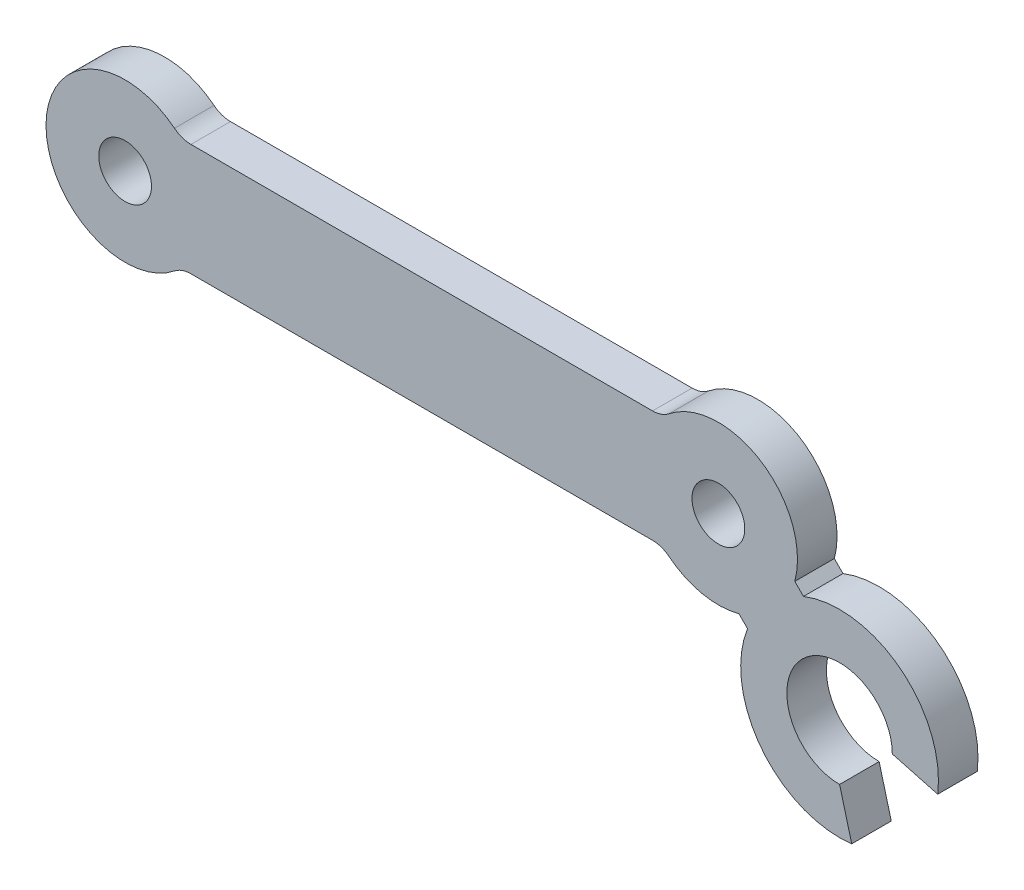
ISO-10303-21;
HEADER;
FILE_DESCRIPTION(('STEP AP214'),'2;1');
FILE_NAME('part.step','',(''),(''),'','','');
FILE_SCHEMA(('AUTOMOTIVE_DESIGN { 1 0 10303 214 1 1 1 1 }'));
ENDSEC;
DATA;
#1=APPLICATION_CONTEXT('core data for automotive mechanical design processes');
#2=APPLICATION_PROTOCOL_DEFINITION('international standard','automotive_design',2000,#1);
#3=PRODUCT_CONTEXT('',#1,'mechanical');
#4=PRODUCT('Part','Part','',(#3));
#5=PRODUCT_RELATED_PRODUCT_CATEGORY('part','',(#4));
#6=PRODUCT_DEFINITION_FORMATION('','',#4);
#7=PRODUCT_DEFINITION_CONTEXT('part definition',#1,'design');
#8=PRODUCT_DEFINITION('design','',#6,#7);
#9=PRODUCT_DEFINITION_SHAPE('','',#8);
#10=(LENGTH_UNIT() NAMED_UNIT(*) SI_UNIT(.MILLI.,.METRE.));
#11=(NAMED_UNIT(*) PLANE_ANGLE_UNIT() SI_UNIT($,.RADIAN.));
#12=(NAMED_UNIT(*) SI_UNIT($,.STERADIAN.) SOLID_ANGLE_UNIT());
#13=UNCERTAINTY_MEASURE_WITH_UNIT(LENGTH_MEASURE(1.E-05),#10,'distance_accuracy_value','');
#14=(GEOMETRIC_REPRESENTATION_CONTEXT(3) GLOBAL_UNCERTAINTY_ASSIGNED_CONTEXT((#13)) GLOBAL_UNIT_ASSIGNED_CONTEXT((#10,
#11,#12)) REPRESENTATION_CONTEXT('',''));
#15=CARTESIAN_POINT('',(0.,0.,0.));
#16=DIRECTION('',(0.,0.,1.));
#17=DIRECTION('',(1.,0.,0.));
#18=AXIS2_PLACEMENT_3D('',#15,#16,#17);
#19=CARTESIAN_POINT('',(4.99374608885954,6.25,3.));
#20=DIRECTION('',(0.,0.,-1.));
#21=DIRECTION('',(-1.,0.,0.));
#22=AXIS2_PLACEMENT_3D('',#19,#20,#21);
#23=PLANE('',#22);
#24=CARTESIAN_POINT('',(4.99374608885954,6.25,3.));
#25=DIRECTION('',(0.,0.,-1.));
#26=DIRECTION('',(-1.,0.,0.));
#27=AXIS2_PLACEMENT_3D('',#24,#25,#26);
#28=CIRCLE('',#27,2.);
#29=CARTESIAN_POINT('',(4.99374608885954,4.25,3.));
#30=VERTEX_POINT('',#29);
#31=CARTESIAN_POINT('',(3.74530956664466,4.6875,3.));
#32=VERTEX_POINT('',#31);
#33=EDGE_CURVE('E217',#30,#32,#28,.T.);
#34=ORIENTED_EDGE('',*,*,#33,.T.);
#35=CARTESIAN_POINT('',(0.,0.,3.));
#36=DIRECTION('',(0.,0.,1.));
#37=DIRECTION('',(1.,0.,0.));
#38=AXIS2_PLACEMENT_3D('',#35,#36,#37);
#39=CIRCLE('',#38,6.);
#40=CARTESIAN_POINT('',(3.74530956664466,-4.6875,3.));
#41=VERTEX_POINT('',#40);
#42=EDGE_CURVE('E123',#32,#41,#39,.T.);
#43=ORIENTED_EDGE('',*,*,#42,.T.);
#44=CARTESIAN_POINT('',(4.99374608885954,-6.25,3.));
#45=DIRECTION('',(0.,0.,-1.));
#46=DIRECTION('',(1.,0.,0.));
#47=AXIS2_PLACEMENT_3D('',#44,#45,#46);
#48=CIRCLE('',#47,2.);
#49=CARTESIAN_POINT('',(4.99374608885954,-4.25,3.));
#50=VERTEX_POINT('',#49);
#51=EDGE_CURVE('E256',#41,#50,#48,.T.);
#52=ORIENTED_EDGE('',*,*,#51,.T.);
#53=DIRECTION('',(1.,0.,0.));
#54=VECTOR('',#53,1.);
#55=CARTESIAN_POINT('',(4.99374608885954,-4.25,3.));
#56=LINE('',#55,#54);
#57=CARTESIAN_POINT('',(40.0062539111404,-4.25,3.));
#58=VERTEX_POINT('',#57);
#59=EDGE_CURVE('E275',#50,#58,#56,.T.);
#60=ORIENTED_EDGE('',*,*,#59,.T.);
#61=CARTESIAN_POINT('',(40.0062539111404,-6.25,3.));
#62=DIRECTION('',(0.,0.,-1.));
#63=DIRECTION('',(-1.,0.,0.));
#64=AXIS2_PLACEMENT_3D('',#61,#62,#63);
#65=CIRCLE('',#64,2.);
#66=CARTESIAN_POINT('',(41.2546904333553,-4.6875,3.));
#67=VERTEX_POINT('',#66);
#68=EDGE_CURVE('E272',#58,#67,#65,.T.);
#69=ORIENTED_EDGE('',*,*,#68,.T.);
#70=CARTESIAN_POINT('',(45.,0.,3.));
#71=DIRECTION('',(0.,0.,1.));
#72=DIRECTION('',(-1.,0.,0.));
#73=AXIS2_PLACEMENT_3D('',#70,#71,#72);
#74=CIRCLE('',#73,6.00000000000001);
#75=CARTESIAN_POINT('',(46.5529142706151,-5.79555495773442,3.));
#76=VERTEX_POINT('',#75);
#77=EDGE_CURVE('E274',#67,#76,#74,.T.);
#78=ORIENTED_EDGE('',*,*,#77,.T.);
#79=DIRECTION('',(0.707106781186616,-0.707106781186479,0.));
#80=VECTOR('',#79,1.);
#81=CARTESIAN_POINT('',(46.7677669529664,-6.01040764008564,3.));
#82=LINE('',#81,#80);
#83=CARTESIAN_POINT('',(47.2105122880596,-6.45315297517885,3.));
#84=VERTEX_POINT('',#83);
#85=EDGE_CURVE('E277',#76,#84,#82,.T.);
#86=ORIENTED_EDGE('',*,*,#85,.T.);
#87=CARTESIAN_POINT('',(54.1923881554251,-9.19238815542513,3.));
#88=DIRECTION('',(0.,0.,1.));
#89=DIRECTION('',(1.,0.,0.));
#90=AXIS2_PLACEMENT_3D('',#87,#88,#89);
#91=CIRCLE('',#90,7.5);
#92=CARTESIAN_POINT('',(55.1149486223124,-16.6354306909033,3.));
#93=VERTEX_POINT('',#92);
#94=EDGE_CURVE('E283',#84,#93,#91,.T.);
#95=ORIENTED_EDGE('',*,*,#94,.T.);
#96=DIRECTION('',(-0.258819045102518,0.965925826289069,0.));
#97=VECTOR('',#96,1.);
#98=CARTESIAN_POINT('',(54.1923881554251,-13.1923881554251,3.));
#99=LINE('',#98,#97);
#100=CARTESIAN_POINT('',(54.1923881554251,-13.1923881554251,3.));
#101=VERTEX_POINT('',#100);
#102=EDGE_CURVE('E285',#93,#101,#99,.T.);
#103=ORIENTED_EDGE('',*,*,#102,.T.);
#104=CARTESIAN_POINT('',(54.1923881554251,-9.19238815542513,3.));
#105=DIRECTION('',(0.,0.,-1.));
#106=DIRECTION('',(1.,0.,0.));
#107=AXIS2_PLACEMENT_3D('',#104,#105,#106);
#108=CIRCLE('',#107,4.);
#109=CARTESIAN_POINT('',(58.1923881554251,-9.19238815542513,3.));
#110=VERTEX_POINT('',#109);
#111=EDGE_CURVE('E287',#101,#110,#108,.T.);
#112=ORIENTED_EDGE('',*,*,#111,.T.);
#113=DIRECTION('',(0.965925826289068,-0.258819045102522,0.));
#114=VECTOR('',#113,1.);
#115=CARTESIAN_POINT('',(58.1923881554251,-9.19238815542513,3.));
#116=LINE('',#115,#114);
#117=CARTESIAN_POINT('',(61.6354306909032,-10.1149486223125,3.));
#118=VERTEX_POINT('',#117);
#119=EDGE_CURVE('E289',#110,#118,#116,.T.);
#120=ORIENTED_EDGE('',*,*,#119,.T.);
#121=CARTESIAN_POINT('',(54.1923881554251,-9.19238815542513,3.));
#122=DIRECTION('',(0.,0.,1.));
#123=DIRECTION('',(1.,0.,0.));
#124=AXIS2_PLACEMENT_3D('',#121,#122,#123);
#125=CIRCLE('',#124,7.5);
#126=CARTESIAN_POINT('',(51.453152975179,-2.21051228805952,3.));
#127=VERTEX_POINT('',#126);
#128=EDGE_CURVE('E291',#118,#127,#125,.T.);
#129=ORIENTED_EDGE('',*,*,#128,.T.);
#130=DIRECTION('',(-0.707106781186547,0.707106781186548,0.));
#131=VECTOR('',#130,1.);
#132=CARTESIAN_POINT('',(51.0104076400858,-1.76776695296626,3.));
#133=LINE('',#132,#131);
#134=CARTESIAN_POINT('',(50.7955549577345,-1.55291427061498,3.));
#135=VERTEX_POINT('',#134);
#136=EDGE_CURVE('E166',#127,#135,#133,.T.);
#137=ORIENTED_EDGE('',*,*,#136,.T.);
#138=CARTESIAN_POINT('',(45.,0.,3.));
#139=DIRECTION('',(0.,0.,1.));
#140=DIRECTION('',(-1.,0.,0.));
#141=AXIS2_PLACEMENT_3D('',#138,#139,#140);
#142=CIRCLE('',#141,6.00000000000001);
#143=CARTESIAN_POINT('',(41.2546904333553,4.6875,3.));
#144=VERTEX_POINT('',#143);
#145=EDGE_CURVE('E160',#135,#144,#142,.T.);
#146=ORIENTED_EDGE('',*,*,#145,.T.);
#147=CARTESIAN_POINT('',(40.0062539111404,6.25,3.));
#148=DIRECTION('',(0.,0.,-1.));
#149=DIRECTION('',(1.,0.,0.));
#150=AXIS2_PLACEMENT_3D('',#147,#148,#149);
#151=CIRCLE('',#150,2.);
#152=CARTESIAN_POINT('',(40.0062539111404,4.25,3.));
#153=VERTEX_POINT('',#152);
#154=EDGE_CURVE('E164',#144,#153,#151,.T.);
#155=ORIENTED_EDGE('',*,*,#154,.T.);
#156=DIRECTION('',(-1.,0.,0.));
#157=VECTOR('',#156,1.);
#158=CARTESIAN_POINT('',(4.99374608885954,4.25,3.));
#159=LINE('',#158,#157);
#160=EDGE_CURVE('E56',#153,#30,#159,.T.);
#161=ORIENTED_EDGE('',*,*,#160,.T.);
#162=EDGE_LOOP('',(#34,#43,#52,#60,#69,#78,#86,#95,#103,#112,#120,#129,#137,#146,#155,#161));
#163=FACE_BOUND('',#162,.T.);
#164=CARTESIAN_POINT('',(0.,0.,3.));
#165=DIRECTION('',(0.,0.,1.));
#166=DIRECTION('',(1.,0.,0.));
#167=AXIS2_PLACEMENT_3D('',#164,#165,#166);
#168=CIRCLE('',#167,2.);
#169=CARTESIAN_POINT('',(2.,0.,3.));
#170=VERTEX_POINT('',#169);
#171=EDGE_CURVE('E188',#170,#170,#168,.T.);
#172=ORIENTED_EDGE('',*,*,#171,.F.);
#173=EDGE_LOOP('',(#172));
#174=FACE_BOUND('',#173,.T.);
#175=CARTESIAN_POINT('',(45.,0.,3.));
#176=DIRECTION('',(0.,0.,1.));
#177=DIRECTION('',(-1.,0.,0.));
#178=AXIS2_PLACEMENT_3D('',#175,#176,#177);
#179=CIRCLE('',#178,2.00000000000002);
#180=CARTESIAN_POINT('',(43.,0.,3.));
#181=VERTEX_POINT('',#180);
#182=EDGE_CURVE('E331',#181,#181,#179,.T.);
#183=ORIENTED_EDGE('',*,*,#182,.F.);
#184=EDGE_LOOP('',(#183));
#185=FACE_BOUND('',#184,.T.);
#186=ADVANCED_FACE('F39',(#163,#174,#185),#23,.F.);
#187=CARTESIAN_POINT('',(4.99374608885954,6.25,0.));
#188=DIRECTION('',(0.,0.,-1.));
#189=DIRECTION('',(-1.,0.,0.));
#190=AXIS2_PLACEMENT_3D('',#187,#188,#189);
#191=PLANE('',#190);
#192=CARTESIAN_POINT('',(0.,0.,0.));
#193=DIRECTION('',(0.,0.,1.));
#194=DIRECTION('',(1.,0.,0.));
#195=AXIS2_PLACEMENT_3D('',#192,#193,#194);
#196=CIRCLE('',#195,2.);
#197=CARTESIAN_POINT('',(2.,0.,0.));
#198=VERTEX_POINT('',#197);
#199=EDGE_CURVE('E336',#198,#198,#196,.T.);
#200=ORIENTED_EDGE('',*,*,#199,.T.);
#201=EDGE_LOOP('',(#200));
#202=FACE_BOUND('',#201,.T.);
#203=CARTESIAN_POINT('',(4.99374608885954,6.25,0.));
#204=DIRECTION('',(0.,0.,-1.));
#205=DIRECTION('',(-1.,0.,0.));
#206=AXIS2_PLACEMENT_3D('',#203,#204,#205);
#207=CIRCLE('',#206,2.);
#208=CARTESIAN_POINT('',(4.99374608885954,4.25,0.));
#209=VERTEX_POINT('',#208);
#210=CARTESIAN_POINT('',(3.74530956664466,4.6875,0.));
#211=VERTEX_POINT('',#210);
#212=EDGE_CURVE('E184',#209,#211,#207,.T.);
#213=ORIENTED_EDGE('',*,*,#212,.F.);
#214=DIRECTION('',(-1.,0.,0.));
#215=VECTOR('',#214,1.);
#216=CARTESIAN_POINT('',(4.99374608885954,4.25,0.));
#217=LINE('',#216,#215);
#218=CARTESIAN_POINT('',(40.0062539111404,4.25,0.));
#219=VERTEX_POINT('',#218);
#220=EDGE_CURVE('E115',#219,#209,#217,.T.);
#221=ORIENTED_EDGE('',*,*,#220,.F.);
#222=CARTESIAN_POINT('',(40.0062539111404,6.25,0.));
#223=DIRECTION('',(0.,0.,-1.));
#224=DIRECTION('',(1.,0.,0.));
#225=AXIS2_PLACEMENT_3D('',#222,#223,#224);
#226=CIRCLE('',#225,2.);
#227=CARTESIAN_POINT('',(41.2546904333553,4.6875,0.));
#228=VERTEX_POINT('',#227);
#229=EDGE_CURVE('E109',#228,#219,#226,.T.);
#230=ORIENTED_EDGE('',*,*,#229,.F.);
#231=CARTESIAN_POINT('',(45.,0.,0.));
#232=DIRECTION('',(0.,0.,1.));
#233=DIRECTION('',(-1.,0.,0.));
#234=AXIS2_PLACEMENT_3D('',#231,#232,#233);
#235=CIRCLE('',#234,6.00000000000001);
#236=CARTESIAN_POINT('',(50.7955549577345,-1.55291427061498,0.));
#237=VERTEX_POINT('',#236);
#238=EDGE_CURVE('E174',#237,#228,#235,.T.);
#239=ORIENTED_EDGE('',*,*,#238,.F.);
#240=DIRECTION('',(-0.707106781186599,0.707106781186496,0.));
#241=VECTOR('',#240,1.);
#242=CARTESIAN_POINT('',(51.0104076400858,-1.76776695296626,0.));
#243=LINE('',#242,#241);
#244=CARTESIAN_POINT('',(51.453152975179,-2.21051228805952,0.));
#245=VERTEX_POINT('',#244);
#246=EDGE_CURVE('E212',#245,#237,#243,.T.);
#247=ORIENTED_EDGE('',*,*,#246,.F.);
#248=CARTESIAN_POINT('',(54.1923881554251,-9.19238815542513,0.));
#249=DIRECTION('',(0.,0.,1.));
#250=DIRECTION('',(1.,0.,0.));
#251=AXIS2_PLACEMENT_3D('',#248,#249,#250);
#252=CIRCLE('',#251,7.5);
#253=CARTESIAN_POINT('',(61.6354306909032,-10.1149486223125,0.));
#254=VERTEX_POINT('',#253);
#255=EDGE_CURVE('E209',#254,#245,#252,.T.);
#256=ORIENTED_EDGE('',*,*,#255,.F.);
#257=DIRECTION('',(0.965925826289068,-0.258819045102522,0.));
#258=VECTOR('',#257,1.);
#259=CARTESIAN_POINT('',(58.1923881554251,-9.19238815542513,0.));
#260=LINE('',#259,#258);
#261=CARTESIAN_POINT('',(58.1923881554251,-9.19238815542513,0.));
#262=VERTEX_POINT('',#261);
#263=EDGE_CURVE('E207',#262,#254,#260,.T.);
#264=ORIENTED_EDGE('',*,*,#263,.F.);
#265=CARTESIAN_POINT('',(54.1923881554251,-9.19238815542513,0.));
#266=DIRECTION('',(0.,0.,-1.));
#267=DIRECTION('',(1.,0.,0.));
#268=AXIS2_PLACEMENT_3D('',#265,#266,#267);
#269=CIRCLE('',#268,4.);
#270=CARTESIAN_POINT('',(54.1923881554251,-13.1923881554251,0.));
#271=VERTEX_POINT('',#270);
#272=EDGE_CURVE('E205',#271,#262,#269,.T.);
#273=ORIENTED_EDGE('',*,*,#272,.F.);
#274=DIRECTION('',(-0.258819045102518,0.965925826289069,0.));
#275=VECTOR('',#274,1.);
#276=CARTESIAN_POINT('',(54.1923881554251,-13.1923881554251,0.));
#277=LINE('',#276,#275);
#278=CARTESIAN_POINT('',(55.1149486223124,-16.6354306909033,0.));
#279=VERTEX_POINT('',#278);
#280=EDGE_CURVE('E203',#279,#271,#277,.T.);
#281=ORIENTED_EDGE('',*,*,#280,.F.);
#282=CARTESIAN_POINT('',(54.1923881554251,-9.19238815542513,0.));
#283=DIRECTION('',(0.,0.,1.));
#284=DIRECTION('',(1.,0.,0.));
#285=AXIS2_PLACEMENT_3D('',#282,#283,#284);
#286=CIRCLE('',#285,7.5);
#287=CARTESIAN_POINT('',(47.2105122880596,-6.45315297517885,0.));
#288=VERTEX_POINT('',#287);
#289=EDGE_CURVE('E201',#288,#279,#286,.T.);
#290=ORIENTED_EDGE('',*,*,#289,.F.);
#291=DIRECTION('',(0.707106781186542,-0.707106781186553,0.));
#292=VECTOR('',#291,1.);
#293=CARTESIAN_POINT('',(46.7677669529664,-6.01040764008564,0.));
#294=LINE('',#293,#292);
#295=CARTESIAN_POINT('',(46.5529142706151,-5.79555495773442,0.));
#296=VERTEX_POINT('',#295);
#297=EDGE_CURVE('E199',#296,#288,#294,.T.);
#298=ORIENTED_EDGE('',*,*,#297,.F.);
#299=CARTESIAN_POINT('',(45.,0.,0.));
#300=DIRECTION('',(0.,0.,1.));
#301=DIRECTION('',(-1.,0.,0.));
#302=AXIS2_PLACEMENT_3D('',#299,#300,#301);
#303=CIRCLE('',#302,6.00000000000001);
#304=CARTESIAN_POINT('',(41.2546904333553,-4.6875,0.));
#305=VERTEX_POINT('',#304);
#306=EDGE_CURVE('E196',#305,#296,#303,.T.);
#307=ORIENTED_EDGE('',*,*,#306,.F.);
#308=CARTESIAN_POINT('',(40.0062539111404,-6.25,0.));
#309=DIRECTION('',(0.,0.,-1.));
#310=DIRECTION('',(-1.,0.,0.));
#311=AXIS2_PLACEMENT_3D('',#308,#309,#310);
#312=CIRCLE('',#311,2.);
#313=CARTESIAN_POINT('',(40.0062539111404,-4.25,0.));
#314=VERTEX_POINT('',#313);
#315=EDGE_CURVE('E194',#314,#305,#312,.T.);
#316=ORIENTED_EDGE('',*,*,#315,.F.);
#317=DIRECTION('',(1.,0.,0.));
#318=VECTOR('',#317,1.);
#319=CARTESIAN_POINT('',(4.99374608885954,-4.25,0.));
#320=LINE('',#319,#318);
#321=CARTESIAN_POINT('',(4.99374608885954,-4.25,0.));
#322=VERTEX_POINT('',#321);
#323=EDGE_CURVE('E192',#322,#314,#320,.T.);
#324=ORIENTED_EDGE('',*,*,#323,.F.);
#325=CARTESIAN_POINT('',(4.99374608885954,-6.25,0.));
#326=DIRECTION('',(0.,0.,-1.));
#327=DIRECTION('',(1.,0.,0.));
#328=AXIS2_PLACEMENT_3D('',#325,#326,#327);
#329=CIRCLE('',#328,2.);
#330=CARTESIAN_POINT('',(3.74530956664466,-4.6875,0.));
#331=VERTEX_POINT('',#330);
#332=EDGE_CURVE('E190',#331,#322,#329,.T.);
#333=ORIENTED_EDGE('',*,*,#332,.F.);
#334=CARTESIAN_POINT('',(0.,0.,0.));
#335=DIRECTION('',(0.,0.,1.));
#336=DIRECTION('',(1.,0.,0.));
#337=AXIS2_PLACEMENT_3D('',#334,#335,#336);
#338=CIRCLE('',#337,6.);
#339=EDGE_CURVE('E187',#211,#331,#338,.T.);
#340=ORIENTED_EDGE('',*,*,#339,.F.);
#341=EDGE_LOOP('',(#213,#221,#230,#239,#247,#256,#264,#273,#281,#290,#298,#307,#316,#324,#333,#340));
#342=FACE_BOUND('',#341,.T.);
#343=CARTESIAN_POINT('',(45.,0.,0.));
#344=DIRECTION('',(0.,0.,1.));
#345=DIRECTION('',(-1.,0.,0.));
#346=AXIS2_PLACEMENT_3D('',#343,#344,#345);
#347=CIRCLE('',#346,2.00000000000002);
#348=CARTESIAN_POINT('',(43.,0.,0.));
#349=VERTEX_POINT('',#348);
#350=EDGE_CURVE('E334',#349,#349,#347,.T.);
#351=ORIENTED_EDGE('',*,*,#350,.T.);
#352=EDGE_LOOP('',(#351));
#353=FACE_BOUND('',#352,.T.);
#354=ADVANCED_FACE('F260',(#202,#342,#353),#191,.T.);
#355=CARTESIAN_POINT('',(4.99374608885954,6.25,3.));
#356=DIRECTION('',(0.,0.,-1.));
#357=DIRECTION('',(-1.,0.,0.));
#358=AXIS2_PLACEMENT_3D('',#355,#356,#357);
#359=CYLINDRICAL_SURFACE('',#358,2.);
#360=ORIENTED_EDGE('',*,*,#212,.T.);
#361=DIRECTION('',(0.,0.,-1.));
#362=VECTOR('',#361,1.);
#363=CARTESIAN_POINT('',(3.74530956664466,4.6875,3.));
#364=LINE('',#363,#362);
#365=EDGE_CURVE('E11',#32,#211,#364,.T.);
#366=ORIENTED_EDGE('',*,*,#365,.F.);
#367=ORIENTED_EDGE('',*,*,#33,.F.);
#368=DIRECTION('',(0.,0.,-1.));
#369=VECTOR('',#368,1.);
#370=CARTESIAN_POINT('',(4.99374608885954,4.25,3.));
#371=LINE('',#370,#369);
#372=EDGE_CURVE('E180',#30,#209,#371,.T.);
#373=ORIENTED_EDGE('',*,*,#372,.T.);
#374=EDGE_LOOP('',(#360,#366,#367,#373));
#375=FACE_BOUND('',#374,.T.);
#376=ADVANCED_FACE('F41',(#375),#359,.F.);
#377=CARTESIAN_POINT('',(0.,0.,3.));
#378=DIRECTION('',(0.,0.,-1.));
#379=DIRECTION('',(-1.,0.,0.));
#380=AXIS2_PLACEMENT_3D('',#377,#378,#379);
#381=CYLINDRICAL_SURFACE('',#380,6.);
#382=ORIENTED_EDGE('',*,*,#339,.T.);
#383=DIRECTION('',(0.,0.,-1.));
#384=VECTOR('',#383,1.);
#385=CARTESIAN_POINT('',(3.74530956664466,-4.6875,3.));
#386=LINE('',#385,#384);
#387=EDGE_CURVE('E48',#41,#331,#386,.T.);
#388=ORIENTED_EDGE('',*,*,#387,.F.);
#389=ORIENTED_EDGE('',*,*,#42,.F.);
#390=ORIENTED_EDGE('',*,*,#365,.T.);
#391=EDGE_LOOP('',(#382,#388,#389,#390));
#392=FACE_BOUND('',#391,.T.);
#393=ADVANCED_FACE('F485',(#392),#381,.T.);
#394=CARTESIAN_POINT('',(4.99374608885954,-6.25,3.));
#395=DIRECTION('',(0.,0.,-1.));
#396=DIRECTION('',(-1.,0.,0.));
#397=AXIS2_PLACEMENT_3D('',#394,#395,#396);
#398=CYLINDRICAL_SURFACE('',#397,2.);
#399=ORIENTED_EDGE('',*,*,#332,.T.);
#400=DIRECTION('',(0.,0.,-1.));
#401=VECTOR('',#400,1.);
#402=CARTESIAN_POINT('',(4.99374608885954,-4.25,3.));
#403=LINE('',#402,#401);
#404=EDGE_CURVE('E248',#50,#322,#403,.T.);
#405=ORIENTED_EDGE('',*,*,#404,.F.);
#406=ORIENTED_EDGE('',*,*,#51,.F.);
#407=ORIENTED_EDGE('',*,*,#387,.T.);
#408=EDGE_LOOP('',(#399,#405,#406,#407));
#409=FACE_BOUND('',#408,.T.);
#410=ADVANCED_FACE('F254',(#409),#398,.F.);
#411=CARTESIAN_POINT('',(4.99374608885954,-4.25,3.));
#412=DIRECTION('',(0.,1.,0.));
#413=DIRECTION('',(0.,0.,1.));
#414=AXIS2_PLACEMENT_3D('',#411,#412,#413);
#415=PLANE('',#414);
#416=ORIENTED_EDGE('',*,*,#323,.T.);
#417=DIRECTION('',(0.,0.,-1.));
#418=VECTOR('',#417,1.);
#419=CARTESIAN_POINT('',(40.0062539111404,-4.25,3.));
#420=LINE('',#419,#418);
#421=EDGE_CURVE('E245',#58,#314,#420,.T.);
#422=ORIENTED_EDGE('',*,*,#421,.F.);
#423=ORIENTED_EDGE('',*,*,#59,.F.);
#424=ORIENTED_EDGE('',*,*,#404,.T.);
#425=EDGE_LOOP('',(#416,#422,#423,#424));
#426=FACE_BOUND('',#425,.T.);
#427=ADVANCED_FACE('F266',(#426),#415,.F.);
#428=CARTESIAN_POINT('',(40.0062539111404,-6.25,3.));
#429=DIRECTION('',(0.,0.,-1.));
#430=DIRECTION('',(-1.,0.,0.));
#431=AXIS2_PLACEMENT_3D('',#428,#429,#430);
#432=CYLINDRICAL_SURFACE('',#431,2.);
#433=ORIENTED_EDGE('',*,*,#315,.T.);
#434=DIRECTION('',(0.,0.,-1.));
#435=VECTOR('',#434,1.);
#436=CARTESIAN_POINT('',(41.2546904333553,-4.6875,3.));
#437=LINE('',#436,#435);
#438=EDGE_CURVE('E242',#67,#305,#437,.T.);
#439=ORIENTED_EDGE('',*,*,#438,.F.);
#440=ORIENTED_EDGE('',*,*,#68,.F.);
#441=ORIENTED_EDGE('',*,*,#421,.T.);
#442=EDGE_LOOP('',(#433,#439,#440,#441));
#443=FACE_BOUND('',#442,.T.);
#444=ADVANCED_FACE('F270',(#443),#432,.F.);
#445=CARTESIAN_POINT('',(45.,0.,3.));
#446=DIRECTION('',(0.,0.,-1.));
#447=DIRECTION('',(-1.,0.,0.));
#448=AXIS2_PLACEMENT_3D('',#445,#446,#447);
#449=CYLINDRICAL_SURFACE('',#448,6.00000000000001);
#450=ORIENTED_EDGE('',*,*,#306,.T.);
#451=DIRECTION('',(0.,0.,-1.));
#452=VECTOR('',#451,1.);
#453=CARTESIAN_POINT('',(46.5529142706151,-5.79555495773442,3.));
#454=LINE('',#453,#452);
#455=EDGE_CURVE('E239',#76,#296,#454,.T.);
#456=ORIENTED_EDGE('',*,*,#455,.F.);
#457=ORIENTED_EDGE('',*,*,#77,.F.);
#458=ORIENTED_EDGE('',*,*,#438,.T.);
#459=EDGE_LOOP('',(#450,#456,#457,#458));
#460=FACE_BOUND('',#459,.T.);
#461=ADVANCED_FACE('F446',(#460),#449,.T.);
#462=CARTESIAN_POINT('',(46.7677669529664,-6.01040764008564,3.));
#463=DIRECTION('',(0.707106781186553,0.707106781186542,0.));
#464=DIRECTION('',(-0.707106781186542,0.707106781186553,0.));
#465=AXIS2_PLACEMENT_3D('',#462,#463,#464);
#466=PLANE('',#465);
#467=ORIENTED_EDGE('',*,*,#297,.T.);
#468=DIRECTION('',(0.,0.,-1.));
#469=VECTOR('',#468,1.);
#470=CARTESIAN_POINT('',(47.2105122880596,-6.45315297517885,3.));
#471=LINE('',#470,#469);
#472=EDGE_CURVE('E236',#84,#288,#471,.T.);
#473=ORIENTED_EDGE('',*,*,#472,.F.);
#474=ORIENTED_EDGE('',*,*,#85,.F.);
#475=ORIENTED_EDGE('',*,*,#455,.T.);
#476=EDGE_LOOP('',(#467,#473,#474,#475));
#477=FACE_BOUND('',#476,.T.);
#478=ADVANCED_FACE('F435',(#477),#466,.F.);
#479=CARTESIAN_POINT('',(54.1923881554251,-9.19238815542513,3.));
#480=DIRECTION('',(0.,0.,-1.));
#481=DIRECTION('',(-1.,0.,0.));
#482=AXIS2_PLACEMENT_3D('',#479,#480,#481);
#483=CYLINDRICAL_SURFACE('',#482,7.5);
#484=ORIENTED_EDGE('',*,*,#289,.T.);
#485=DIRECTION('',(0.,0.,-1.));
#486=VECTOR('',#485,1.);
#487=CARTESIAN_POINT('',(55.1149486223124,-16.6354306909033,3.));
#488=LINE('',#487,#486);
#489=EDGE_CURVE('E233',#93,#279,#488,.T.);
#490=ORIENTED_EDGE('',*,*,#489,.F.);
#491=ORIENTED_EDGE('',*,*,#94,.F.);
#492=ORIENTED_EDGE('',*,*,#472,.T.);
#493=EDGE_LOOP('',(#484,#490,#491,#492));
#494=FACE_BOUND('',#493,.T.);
#495=ADVANCED_FACE('F424',(#494),#483,.T.);
#496=CARTESIAN_POINT('',(54.1923881554251,-13.1923881554251,3.));
#497=DIRECTION('',(-0.965925826289069,-0.258819045102518,0.));
#498=DIRECTION('',(0.258819045102518,-0.965925826289069,0.));
#499=AXIS2_PLACEMENT_3D('',#496,#497,#498);
#500=PLANE('',#499);
#501=ORIENTED_EDGE('',*,*,#280,.T.);
#502=DIRECTION('',(0.,0.,-1.));
#503=VECTOR('',#502,1.);
#504=CARTESIAN_POINT('',(54.1923881554251,-13.1923881554251,3.));
#505=LINE('',#504,#503);
#506=EDGE_CURVE('E230',#101,#271,#505,.T.);
#507=ORIENTED_EDGE('',*,*,#506,.F.);
#508=ORIENTED_EDGE('',*,*,#102,.F.);
#509=ORIENTED_EDGE('',*,*,#489,.T.);
#510=EDGE_LOOP('',(#501,#507,#508,#509));
#511=FACE_BOUND('',#510,.T.);
#512=ADVANCED_FACE('F413',(#511),#500,.F.);
#513=CARTESIAN_POINT('',(54.1923881554251,-9.19238815542513,3.));
#514=DIRECTION('',(0.,0.,-1.));
#515=DIRECTION('',(-1.,0.,0.));
#516=AXIS2_PLACEMENT_3D('',#513,#514,#515);
#517=CYLINDRICAL_SURFACE('',#516,4.);
#518=ORIENTED_EDGE('',*,*,#272,.T.);
#519=DIRECTION('',(0.,0.,-1.));
#520=VECTOR('',#519,1.);
#521=CARTESIAN_POINT('',(58.1923881554251,-9.19238815542513,3.));
#522=LINE('',#521,#520);
#523=EDGE_CURVE('E227',#110,#262,#522,.T.);
#524=ORIENTED_EDGE('',*,*,#523,.F.);
#525=ORIENTED_EDGE('',*,*,#111,.F.);
#526=ORIENTED_EDGE('',*,*,#506,.T.);
#527=EDGE_LOOP('',(#518,#524,#525,#526));
#528=FACE_BOUND('',#527,.T.);
#529=ADVANCED_FACE('F402',(#528),#517,.F.);
#530=CARTESIAN_POINT('',(58.1923881554251,-9.19238815542513,3.));
#531=DIRECTION('',(0.258819045102522,0.965925826289068,0.));
#532=DIRECTION('',(-0.965925826289068,0.258819045102522,0.));
#533=AXIS2_PLACEMENT_3D('',#530,#531,#532);
#534=PLANE('',#533);
#535=ORIENTED_EDGE('',*,*,#263,.T.);
#536=DIRECTION('',(0.,0.,-1.));
#537=VECTOR('',#536,1.);
#538=CARTESIAN_POINT('',(61.6354306909032,-10.1149486223125,3.));
#539=LINE('',#538,#537);
#540=EDGE_CURVE('E224',#118,#254,#539,.T.);
#541=ORIENTED_EDGE('',*,*,#540,.F.);
#542=ORIENTED_EDGE('',*,*,#119,.F.);
#543=ORIENTED_EDGE('',*,*,#523,.T.);
#544=EDGE_LOOP('',(#535,#541,#542,#543));
#545=FACE_BOUND('',#544,.T.);
#546=ADVANCED_FACE('F392',(#545),#534,.F.);
#547=CARTESIAN_POINT('',(54.1923881554251,-9.19238815542513,3.));
#548=DIRECTION('',(0.,0.,-1.));
#549=DIRECTION('',(-1.,0.,0.));
#550=AXIS2_PLACEMENT_3D('',#547,#548,#549);
#551=CYLINDRICAL_SURFACE('',#550,7.5);
#552=ORIENTED_EDGE('',*,*,#255,.T.);
#553=DIRECTION('',(0.,0.,-1.));
#554=VECTOR('',#553,1.);
#555=CARTESIAN_POINT('',(51.453152975179,-2.21051228805952,3.));
#556=LINE('',#555,#554);
#557=EDGE_CURVE('E221',#127,#245,#556,.T.);
#558=ORIENTED_EDGE('',*,*,#557,.F.);
#559=ORIENTED_EDGE('',*,*,#128,.F.);
#560=ORIENTED_EDGE('',*,*,#540,.T.);
#561=EDGE_LOOP('',(#552,#558,#559,#560));
#562=FACE_BOUND('',#561,.T.);
#563=ADVANCED_FACE('F297',(#562),#551,.T.);
#564=CARTESIAN_POINT('',(51.0104076400858,-1.76776695296626,3.));
#565=DIRECTION('',(-0.707106781186496,-0.707106781186599,0.));
#566=DIRECTION('',(0.707106781186599,-0.707106781186496,0.));
#567=AXIS2_PLACEMENT_3D('',#564,#565,#566);
#568=PLANE('',#567);
#569=ORIENTED_EDGE('',*,*,#246,.T.);
#570=DIRECTION('',(0.,0.,-1.));
#571=VECTOR('',#570,1.);
#572=CARTESIAN_POINT('',(50.7955549577345,-1.55291427061498,3.));
#573=LINE('',#572,#571);
#574=EDGE_CURVE('E175',#135,#237,#573,.T.);
#575=ORIENTED_EDGE('',*,*,#574,.F.);
#576=ORIENTED_EDGE('',*,*,#136,.F.);
#577=ORIENTED_EDGE('',*,*,#557,.T.);
#578=EDGE_LOOP('',(#569,#575,#576,#577));
#579=FACE_BOUND('',#578,.T.);
#580=ADVANCED_FACE('F300',(#579),#568,.F.);
#581=CARTESIAN_POINT('',(45.,0.,3.));
#582=DIRECTION('',(0.,0.,-1.));
#583=DIRECTION('',(-1.,0.,0.));
#584=AXIS2_PLACEMENT_3D('',#581,#582,#583);
#585=CYLINDRICAL_SURFACE('',#584,6.00000000000001);
#586=ORIENTED_EDGE('',*,*,#238,.T.);
#587=DIRECTION('',(0.,0.,-1.));
#588=VECTOR('',#587,1.);
#589=CARTESIAN_POINT('',(41.2546904333553,4.6875,3.));
#590=LINE('',#589,#588);
#591=EDGE_CURVE('E171',#144,#228,#590,.T.);
#592=ORIENTED_EDGE('',*,*,#591,.F.);
#593=ORIENTED_EDGE('',*,*,#145,.F.);
#594=ORIENTED_EDGE('',*,*,#574,.T.);
#595=EDGE_LOOP('',(#586,#592,#593,#594));
#596=FACE_BOUND('',#595,.T.);
#597=ADVANCED_FACE('F172',(#596),#585,.T.);
#598=CARTESIAN_POINT('',(40.0062539111404,6.25,3.));
#599=DIRECTION('',(0.,0.,-1.));
#600=DIRECTION('',(-1.,0.,0.));
#601=AXIS2_PLACEMENT_3D('',#598,#599,#600);
#602=CYLINDRICAL_SURFACE('',#601,2.);
#603=ORIENTED_EDGE('',*,*,#229,.T.);
#604=DIRECTION('',(0.,0.,-1.));
#605=VECTOR('',#604,1.);
#606=CARTESIAN_POINT('',(40.0062539111404,4.25,3.));
#607=LINE('',#606,#605);
#608=EDGE_CURVE('E176',#153,#219,#607,.T.);
#609=ORIENTED_EDGE('',*,*,#608,.F.);
#610=ORIENTED_EDGE('',*,*,#154,.F.);
#611=ORIENTED_EDGE('',*,*,#591,.T.);
#612=EDGE_LOOP('',(#603,#609,#610,#611));
#613=FACE_BOUND('',#612,.T.);
#614=ADVANCED_FACE('F178',(#613),#602,.F.);
#615=CARTESIAN_POINT('',(4.99374608885954,4.25,3.));
#616=DIRECTION('',(0.,-1.,0.));
#617=DIRECTION('',(0.,0.,-1.));
#618=AXIS2_PLACEMENT_3D('',#615,#616,#617);
#619=PLANE('',#618);
#620=ORIENTED_EDGE('',*,*,#220,.T.);
#621=ORIENTED_EDGE('',*,*,#372,.F.);
#622=ORIENTED_EDGE('',*,*,#160,.F.);
#623=ORIENTED_EDGE('',*,*,#608,.T.);
#624=EDGE_LOOP('',(#620,#621,#622,#623));
#625=FACE_BOUND('',#624,.T.);
#626=ADVANCED_FACE('F304',(#625),#619,.F.);
#627=CARTESIAN_POINT('',(0.,0.,3.));
#628=DIRECTION('',(0.,0.,-1.));
#629=DIRECTION('',(-1.,0.,0.));
#630=AXIS2_PLACEMENT_3D('',#627,#628,#629);
#631=CYLINDRICAL_SURFACE('',#630,2.);
#632=ORIENTED_EDGE('',*,*,#171,.T.);
#633=EDGE_LOOP('',(#632));
#634=FACE_BOUND('',#633,.T.);
#635=ORIENTED_EDGE('',*,*,#199,.F.);
#636=EDGE_LOOP('',(#635));
#637=FACE_BOUND('',#636,.T.);
#638=ADVANCED_FACE('F306',(#634,#637),#631,.F.);
#639=CARTESIAN_POINT('',(45.,0.,3.));
#640=DIRECTION('',(0.,0.,-1.));
#641=DIRECTION('',(-1.,0.,0.));
#642=AXIS2_PLACEMENT_3D('',#639,#640,#641);
#643=CYLINDRICAL_SURFACE('',#642,2.00000000000002);
#644=ORIENTED_EDGE('',*,*,#182,.T.);
#645=EDGE_LOOP('',(#644));
#646=FACE_BOUND('',#645,.T.);
#647=ORIENTED_EDGE('',*,*,#350,.F.);
#648=EDGE_LOOP('',(#647));
#649=FACE_BOUND('',#648,.T.);
#650=ADVANCED_FACE('F312',(#646,#649),#643,.F.);
#651=CLOSED_SHELL('',(#186,#354,#376,#393,#410,#427,#444,#461,#478,#495,#512,#529,#546,#563,
#580,#597,#614,#626,#638,#650));
#652=MANIFOLD_SOLID_BREP('B2',#651);
#653=ADVANCED_BREP_SHAPE_REPRESENTATION('',(#18,#652),#14);
#654=SHAPE_DEFINITION_REPRESENTATION(#9,#653);
ENDSEC;
END-ISO-10303-21;
